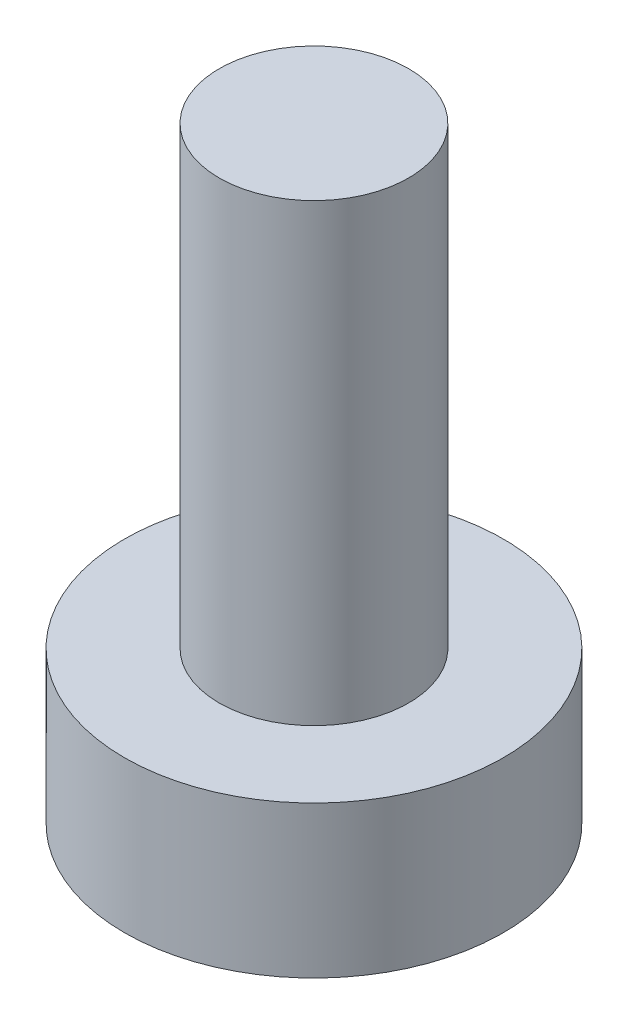
ISO-10303-21;
HEADER;
FILE_DESCRIPTION(('STEP AP214'),'2;1');
FILE_NAME('part.step','',(''),(''),'','','');
FILE_SCHEMA(('AUTOMOTIVE_DESIGN { 1 0 10303 214 1 1 1 1 }'));
ENDSEC;
DATA;
#1=APPLICATION_CONTEXT('core data for automotive mechanical design processes');
#2=APPLICATION_PROTOCOL_DEFINITION('international standard','automotive_design',2000,#1);
#3=PRODUCT_CONTEXT('',#1,'mechanical');
#4=PRODUCT('Part','Part','',(#3));
#5=PRODUCT_RELATED_PRODUCT_CATEGORY('part','',(#4));
#6=PRODUCT_DEFINITION_FORMATION('','',#4);
#7=PRODUCT_DEFINITION_CONTEXT('part definition',#1,'design');
#8=PRODUCT_DEFINITION('design','',#6,#7);
#9=PRODUCT_DEFINITION_SHAPE('','',#8);
#10=(LENGTH_UNIT() NAMED_UNIT(*) SI_UNIT(.MILLI.,.METRE.));
#11=(NAMED_UNIT(*) PLANE_ANGLE_UNIT() SI_UNIT($,.RADIAN.));
#12=(NAMED_UNIT(*) SI_UNIT($,.STERADIAN.) SOLID_ANGLE_UNIT());
#13=UNCERTAINTY_MEASURE_WITH_UNIT(LENGTH_MEASURE(1.E-05),#10,'distance_accuracy_value','');
#14=(GEOMETRIC_REPRESENTATION_CONTEXT(3) GLOBAL_UNCERTAINTY_ASSIGNED_CONTEXT((#13)) GLOBAL_UNIT_ASSIGNED_CONTEXT((#10,
#11,#12)) REPRESENTATION_CONTEXT('',''));
#15=CARTESIAN_POINT('',(0.,0.,0.));
#16=DIRECTION('',(0.,0.,1.));
#17=DIRECTION('',(1.,0.,0.));
#18=AXIS2_PLACEMENT_3D('',#15,#16,#17);
#19=CARTESIAN_POINT('',(0.,4.,0.));
#20=DIRECTION('',(0.,-1.,0.));
#21=DIRECTION('',(0.,0.,-1.));
#22=AXIS2_PLACEMENT_3D('',#19,#20,#21);
#23=CYLINDRICAL_SURFACE('',#22,5.);
#24=CARTESIAN_POINT('',(0.,4.,0.));
#25=DIRECTION('',(0.,1.,0.));
#26=DIRECTION('',(0.,0.,1.));
#27=AXIS2_PLACEMENT_3D('',#24,#25,#26);
#28=CIRCLE('',#27,5.);
#29=CARTESIAN_POINT('',(0.,4.,5.));
#30=VERTEX_POINT('',#29);
#31=EDGE_CURVE('E50',#30,#30,#28,.T.);
#32=ORIENTED_EDGE('',*,*,#31,.F.);
#33=EDGE_LOOP('',(#32));
#34=FACE_BOUND('',#33,.T.);
#35=CARTESIAN_POINT('',(0.,0.,0.));
#36=DIRECTION('',(0.,1.,0.));
#37=DIRECTION('',(0.,0.,1.));
#38=AXIS2_PLACEMENT_3D('',#35,#36,#37);
#39=CIRCLE('',#38,5.);
#40=CARTESIAN_POINT('',(0.,0.,5.));
#41=VERTEX_POINT('',#40);
#42=EDGE_CURVE('E45',#41,#41,#39,.T.);
#43=ORIENTED_EDGE('',*,*,#42,.T.);
#44=EDGE_LOOP('',(#43));
#45=FACE_BOUND('',#44,.T.);
#46=ADVANCED_FACE('F42',(#34,#45),#23,.T.);
#47=CARTESIAN_POINT('',(0.,4.,0.));
#48=DIRECTION('',(0.,1.,0.));
#49=DIRECTION('',(0.,0.,1.));
#50=AXIS2_PLACEMENT_3D('',#47,#48,#49);
#51=PLANE('',#50);
#52=CARTESIAN_POINT('',(0.,4.,0.));
#53=DIRECTION('',(0.,1.,0.));
#54=DIRECTION('',(0.,0.,1.));
#55=AXIS2_PLACEMENT_3D('',#52,#53,#54);
#56=CIRCLE('',#55,2.5);
#57=CARTESIAN_POINT('',(0.,4.,2.5));
#58=VERTEX_POINT('',#57);
#59=EDGE_CURVE('E11',#58,#58,#56,.T.);
#60=ORIENTED_EDGE('',*,*,#59,.F.);
#61=EDGE_LOOP('',(#60));
#62=FACE_BOUND('',#61,.T.);
#63=ORIENTED_EDGE('',*,*,#31,.T.);
#64=EDGE_LOOP('',(#63));
#65=FACE_BOUND('',#64,.T.);
#66=ADVANCED_FACE('F162',(#62,#65),#51,.T.);
#67=CARTESIAN_POINT('',(0.,0.,0.));
#68=DIRECTION('',(0.,1.,0.));
#69=DIRECTION('',(0.,0.,1.));
#70=AXIS2_PLACEMENT_3D('',#67,#68,#69);
#71=PLANE('',#70);
#72=DIRECTION('',(0.5,0.,-0.866025403784439));
#73=VECTOR('',#72,1.);
#74=CARTESIAN_POINT('',(-3.46410161513775,0.,0.));
#75=LINE('',#74,#73);
#76=CARTESIAN_POINT('',(-3.46410161513776,0.,0.));
#77=VERTEX_POINT('',#76);
#78=CARTESIAN_POINT('',(-1.73205080756888,0.,-3.));
#79=VERTEX_POINT('',#78);
#80=EDGE_CURVE('E132',#77,#79,#75,.T.);
#81=ORIENTED_EDGE('',*,*,#80,.F.);
#82=DIRECTION('',(-0.5,0.,-0.866025403784439));
#83=VECTOR('',#82,1.);
#84=CARTESIAN_POINT('',(-1.73205080756888,0.,3.));
#85=LINE('',#84,#83);
#86=CARTESIAN_POINT('',(-1.73205080756888,0.,3.));
#87=VERTEX_POINT('',#86);
#88=EDGE_CURVE('E58',#87,#77,#85,.T.);
#89=ORIENTED_EDGE('',*,*,#88,.F.);
#90=DIRECTION('',(-1.,0.,0.));
#91=VECTOR('',#90,1.);
#92=CARTESIAN_POINT('',(1.73205080756888,0.,3.));
#93=LINE('',#92,#91);
#94=CARTESIAN_POINT('',(1.73205080756888,0.,3.));
#95=VERTEX_POINT('',#94);
#96=EDGE_CURVE('E141',#95,#87,#93,.T.);
#97=ORIENTED_EDGE('',*,*,#96,.F.);
#98=DIRECTION('',(-0.5,0.,0.866025403784439));
#99=VECTOR('',#98,1.);
#100=CARTESIAN_POINT('',(3.46410161513775,0.,0.));
#101=LINE('',#100,#99);
#102=CARTESIAN_POINT('',(3.46410161513775,0.,0.));
#103=VERTEX_POINT('',#102);
#104=EDGE_CURVE('E139',#103,#95,#101,.T.);
#105=ORIENTED_EDGE('',*,*,#104,.F.);
#106=DIRECTION('',(0.5,0.,0.866025403784439));
#107=VECTOR('',#106,1.);
#108=CARTESIAN_POINT('',(1.73205080756888,0.,-3.));
#109=LINE('',#108,#107);
#110=CARTESIAN_POINT('',(1.73205080756888,0.,-3.));
#111=VERTEX_POINT('',#110);
#112=EDGE_CURVE('E106',#111,#103,#109,.T.);
#113=ORIENTED_EDGE('',*,*,#112,.F.);
#114=DIRECTION('',(1.,0.,0.));
#115=VECTOR('',#114,1.);
#116=CARTESIAN_POINT('',(-1.73205080756888,0.,-3.));
#117=LINE('',#116,#115);
#118=EDGE_CURVE('E135',#79,#111,#117,.T.);
#119=ORIENTED_EDGE('',*,*,#118,.F.);
#120=EDGE_LOOP('',(#81,#89,#97,#105,#113,#119));
#121=FACE_BOUND('',#120,.T.);
#122=ORIENTED_EDGE('',*,*,#42,.F.);
#123=EDGE_LOOP('',(#122));
#124=FACE_BOUND('',#123,.T.);
#125=ADVANCED_FACE('F159',(#121,#124),#71,.F.);
#126=CARTESIAN_POINT('',(0.,16.,0.));
#127=DIRECTION('',(0.,-1.,0.));
#128=DIRECTION('',(0.,0.,-1.));
#129=AXIS2_PLACEMENT_3D('',#126,#127,#128);
#130=CYLINDRICAL_SURFACE('',#129,2.5);
#131=CARTESIAN_POINT('',(0.,16.,0.));
#132=DIRECTION('',(0.,1.,0.));
#133=DIRECTION('',(0.,0.,1.));
#134=AXIS2_PLACEMENT_3D('',#131,#132,#133);
#135=CIRCLE('',#134,2.5);
#136=CARTESIAN_POINT('',(0.,16.,2.5));
#137=VERTEX_POINT('',#136);
#138=EDGE_CURVE('E145',#137,#137,#135,.T.);
#139=ORIENTED_EDGE('',*,*,#138,.F.);
#140=EDGE_LOOP('',(#139));
#141=FACE_BOUND('',#140,.T.);
#142=ORIENTED_EDGE('',*,*,#59,.T.);
#143=EDGE_LOOP('',(#142));
#144=FACE_BOUND('',#143,.T.);
#145=ADVANCED_FACE('F161',(#141,#144),#130,.T.);
#146=CARTESIAN_POINT('',(0.,16.,0.));
#147=DIRECTION('',(0.,1.,0.));
#148=DIRECTION('',(0.,0.,1.));
#149=AXIS2_PLACEMENT_3D('',#146,#147,#148);
#150=PLANE('',#149);
#151=ORIENTED_EDGE('',*,*,#138,.T.);
#152=EDGE_LOOP('',(#151));
#153=FACE_BOUND('',#152,.T.);
#154=ADVANCED_FACE('F168',(#153),#150,.T.);
#155=CARTESIAN_POINT('',(-1.73205080756888,1.,3.));
#156=DIRECTION('',(-0.866025403784439,0.,0.5));
#157=DIRECTION('',(0.5,0.,0.866025403784439));
#158=AXIS2_PLACEMENT_3D('',#155,#156,#157);
#159=PLANE('',#158);
#160=ORIENTED_EDGE('',*,*,#88,.T.);
#161=DIRECTION('',(0.,-1.,0.));
#162=VECTOR('',#161,1.);
#163=CARTESIAN_POINT('',(-3.46410161513775,1.,0.));
#164=LINE('',#163,#162);
#165=CARTESIAN_POINT('',(-3.46410161513775,1.,0.));
#166=VERTEX_POINT('',#165);
#167=EDGE_CURVE('E88',#166,#77,#164,.T.);
#168=ORIENTED_EDGE('',*,*,#167,.F.);
#169=DIRECTION('',(-0.5,0.,-0.866025403784439));
#170=VECTOR('',#169,1.);
#171=CARTESIAN_POINT('',(-1.73205080756888,1.,3.));
#172=LINE('',#171,#170);
#173=CARTESIAN_POINT('',(-1.73205080756888,1.,3.));
#174=VERTEX_POINT('',#173);
#175=EDGE_CURVE('E143',#174,#166,#172,.T.);
#176=ORIENTED_EDGE('',*,*,#175,.F.);
#177=DIRECTION('',(0.,-1.,0.));
#178=VECTOR('',#177,1.);
#179=CARTESIAN_POINT('',(-1.73205080756888,1.,3.));
#180=LINE('',#179,#178);
#181=EDGE_CURVE('E66',#174,#87,#180,.T.);
#182=ORIENTED_EDGE('',*,*,#181,.T.);
#183=EDGE_LOOP('',(#160,#168,#176,#182));
#184=FACE_BOUND('',#183,.T.);
#185=ADVANCED_FACE('F199',(#184),#159,.F.);
#186=CARTESIAN_POINT('',(1.73205080756888,1.,3.));
#187=DIRECTION('',(0.,0.,1.));
#188=DIRECTION('',(1.,0.,0.));
#189=AXIS2_PLACEMENT_3D('',#186,#187,#188);
#190=PLANE('',#189);
#191=ORIENTED_EDGE('',*,*,#96,.T.);
#192=ORIENTED_EDGE('',*,*,#181,.F.);
#193=DIRECTION('',(-1.,0.,0.));
#194=VECTOR('',#193,1.);
#195=CARTESIAN_POINT('',(1.73205080756888,1.,3.));
#196=LINE('',#195,#194);
#197=CARTESIAN_POINT('',(1.73205080756888,1.,3.));
#198=VERTEX_POINT('',#197);
#199=EDGE_CURVE('E118',#198,#174,#196,.T.);
#200=ORIENTED_EDGE('',*,*,#199,.F.);
#201=DIRECTION('',(0.,-1.,0.));
#202=VECTOR('',#201,1.);
#203=CARTESIAN_POINT('',(1.73205080756888,1.,3.));
#204=LINE('',#203,#202);
#205=EDGE_CURVE('E110',#198,#95,#204,.T.);
#206=ORIENTED_EDGE('',*,*,#205,.T.);
#207=EDGE_LOOP('',(#191,#192,#200,#206));
#208=FACE_BOUND('',#207,.T.);
#209=ADVANCED_FACE('F215',(#208),#190,.F.);
#210=CARTESIAN_POINT('',(3.46410161513775,1.,0.));
#211=DIRECTION('',(0.866025403784439,0.,0.5));
#212=DIRECTION('',(0.5,0.,-0.866025403784439));
#213=AXIS2_PLACEMENT_3D('',#210,#211,#212);
#214=PLANE('',#213);
#215=ORIENTED_EDGE('',*,*,#104,.T.);
#216=ORIENTED_EDGE('',*,*,#205,.F.);
#217=DIRECTION('',(-0.5,0.,0.866025403784439));
#218=VECTOR('',#217,1.);
#219=CARTESIAN_POINT('',(3.46410161513775,1.,0.));
#220=LINE('',#219,#218);
#221=CARTESIAN_POINT('',(3.46410161513775,1.,0.));
#222=VERTEX_POINT('',#221);
#223=EDGE_CURVE('E114',#222,#198,#220,.T.);
#224=ORIENTED_EDGE('',*,*,#223,.F.);
#225=DIRECTION('',(0.,-1.,0.));
#226=VECTOR('',#225,1.);
#227=CARTESIAN_POINT('',(3.46410161513775,1.,0.));
#228=LINE('',#227,#226);
#229=EDGE_CURVE('E99',#222,#103,#228,.T.);
#230=ORIENTED_EDGE('',*,*,#229,.T.);
#231=EDGE_LOOP('',(#215,#216,#224,#230));
#232=FACE_BOUND('',#231,.T.);
#233=ADVANCED_FACE('F115',(#232),#214,.F.);
#234=CARTESIAN_POINT('',(1.73205080756888,1.,-3.));
#235=DIRECTION('',(0.866025403784439,0.,-0.5));
#236=DIRECTION('',(-0.5,0.,-0.866025403784439));
#237=AXIS2_PLACEMENT_3D('',#234,#235,#236);
#238=PLANE('',#237);
#239=ORIENTED_EDGE('',*,*,#112,.T.);
#240=ORIENTED_EDGE('',*,*,#229,.F.);
#241=DIRECTION('',(0.5,0.,0.866025403784439));
#242=VECTOR('',#241,1.);
#243=CARTESIAN_POINT('',(1.73205080756888,1.,-3.));
#244=LINE('',#243,#242);
#245=CARTESIAN_POINT('',(1.73205080756888,1.,-3.));
#246=VERTEX_POINT('',#245);
#247=EDGE_CURVE('E103',#246,#222,#244,.T.);
#248=ORIENTED_EDGE('',*,*,#247,.F.);
#249=DIRECTION('',(0.,-1.,0.));
#250=VECTOR('',#249,1.);
#251=CARTESIAN_POINT('',(1.73205080756888,1.,-3.));
#252=LINE('',#251,#250);
#253=EDGE_CURVE('E111',#246,#111,#252,.T.);
#254=ORIENTED_EDGE('',*,*,#253,.T.);
#255=EDGE_LOOP('',(#239,#240,#248,#254));
#256=FACE_BOUND('',#255,.T.);
#257=ADVANCED_FACE('F101',(#256),#238,.F.);
#258=CARTESIAN_POINT('',(-1.73205080756888,1.,-3.));
#259=DIRECTION('',(0.,0.,-1.));
#260=DIRECTION('',(-1.,0.,0.));
#261=AXIS2_PLACEMENT_3D('',#258,#259,#260);
#262=PLANE('',#261);
#263=ORIENTED_EDGE('',*,*,#118,.T.);
#264=ORIENTED_EDGE('',*,*,#253,.F.);
#265=DIRECTION('',(1.,0.,0.));
#266=VECTOR('',#265,1.);
#267=CARTESIAN_POINT('',(-1.73205080756888,1.,-3.));
#268=LINE('',#267,#266);
#269=CARTESIAN_POINT('',(-1.73205080756888,1.,-3.));
#270=VERTEX_POINT('',#269);
#271=EDGE_CURVE('E124',#270,#246,#268,.T.);
#272=ORIENTED_EDGE('',*,*,#271,.F.);
#273=DIRECTION('',(0.,-1.,0.));
#274=VECTOR('',#273,1.);
#275=CARTESIAN_POINT('',(-1.73205080756888,1.,-3.));
#276=LINE('',#275,#274);
#277=EDGE_CURVE('E148',#270,#79,#276,.T.);
#278=ORIENTED_EDGE('',*,*,#277,.T.);
#279=EDGE_LOOP('',(#263,#264,#272,#278));
#280=FACE_BOUND('',#279,.T.);
#281=ADVANCED_FACE('F243',(#280),#262,.F.);
#282=CARTESIAN_POINT('',(-3.46410161513775,1.,0.));
#283=DIRECTION('',(-0.866025403784439,0.,-0.5));
#284=DIRECTION('',(-0.5,0.,0.866025403784439));
#285=AXIS2_PLACEMENT_3D('',#282,#283,#284);
#286=PLANE('',#285);
#287=ORIENTED_EDGE('',*,*,#80,.T.);
#288=ORIENTED_EDGE('',*,*,#277,.F.);
#289=DIRECTION('',(0.5,0.,-0.866025403784439));
#290=VECTOR('',#289,1.);
#291=CARTESIAN_POINT('',(-3.46410161513775,1.,0.));
#292=LINE('',#291,#290);
#293=EDGE_CURVE('E126',#166,#270,#292,.T.);
#294=ORIENTED_EDGE('',*,*,#293,.F.);
#295=ORIENTED_EDGE('',*,*,#167,.T.);
#296=EDGE_LOOP('',(#287,#288,#294,#295));
#297=FACE_BOUND('',#296,.T.);
#298=ADVANCED_FACE('F253',(#297),#286,.F.);
#299=CARTESIAN_POINT('',(0.,1.,0.));
#300=DIRECTION('',(0.,-1.,0.));
#301=DIRECTION('',(0.,0.,-1.));
#302=AXIS2_PLACEMENT_3D('',#299,#300,#301);
#303=PLANE('',#302);
#304=ORIENTED_EDGE('',*,*,#175,.T.);
#305=ORIENTED_EDGE('',*,*,#293,.T.);
#306=ORIENTED_EDGE('',*,*,#271,.T.);
#307=ORIENTED_EDGE('',*,*,#247,.T.);
#308=ORIENTED_EDGE('',*,*,#223,.T.);
#309=ORIENTED_EDGE('',*,*,#199,.T.);
#310=EDGE_LOOP('',(#304,#305,#306,#307,#308,#309));
#311=FACE_BOUND('',#310,.T.);
#312=ADVANCED_FACE('F121',(#311),#303,.T.);
#313=CLOSED_SHELL('',(#46,#66,#125,#145,#154,#185,#209,#233,#257,#281,#298,#312));
#314=MANIFOLD_SOLID_BREP('B2',#313);
#315=ADVANCED_BREP_SHAPE_REPRESENTATION('',(#18,#314),#14);
#316=SHAPE_DEFINITION_REPRESENTATION(#9,#315);
ENDSEC;
END-ISO-10303-21;
